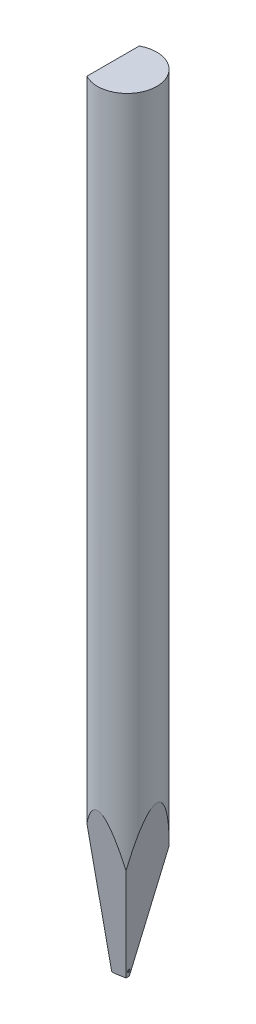
ISO-10303-21;
HEADER;
FILE_DESCRIPTION(('STEP AP214'),'2;1');
FILE_NAME('part.step','',(''),(''),'','','');
FILE_SCHEMA(('AUTOMOTIVE_DESIGN { 1 0 10303 214 1 1 1 1 }'));
ENDSEC;
DATA;
#1=APPLICATION_CONTEXT('core data for automotive mechanical design processes');
#2=APPLICATION_PROTOCOL_DEFINITION('international standard','automotive_design',2000,#1);
#3=PRODUCT_CONTEXT('',#1,'mechanical');
#4=PRODUCT('Part','Part','',(#3));
#5=PRODUCT_RELATED_PRODUCT_CATEGORY('part','',(#4));
#6=PRODUCT_DEFINITION_FORMATION('','',#4);
#7=PRODUCT_DEFINITION_CONTEXT('part definition',#1,'design');
#8=PRODUCT_DEFINITION('design','',#6,#7);
#9=PRODUCT_DEFINITION_SHAPE('','',#8);
#10=(LENGTH_UNIT() NAMED_UNIT(*) SI_UNIT(.MILLI.,.METRE.));
#11=(NAMED_UNIT(*) PLANE_ANGLE_UNIT() SI_UNIT($,.RADIAN.));
#12=(NAMED_UNIT(*) SI_UNIT($,.STERADIAN.) SOLID_ANGLE_UNIT());
#13=UNCERTAINTY_MEASURE_WITH_UNIT(LENGTH_MEASURE(1.E-05),#10,'distance_accuracy_value','');
#14=(GEOMETRIC_REPRESENTATION_CONTEXT(3) GLOBAL_UNCERTAINTY_ASSIGNED_CONTEXT((#13)) GLOBAL_UNIT_ASSIGNED_CONTEXT((#10,
#11,#12)) REPRESENTATION_CONTEXT('',''));
#15=CARTESIAN_POINT('',(0.,0.,0.));
#16=DIRECTION('',(0.,0.,1.));
#17=DIRECTION('',(1.,0.,0.));
#18=AXIS2_PLACEMENT_3D('',#15,#16,#17);
#19=CARTESIAN_POINT('',(-0.28702,0.,27.2760283406468));
#20=DIRECTION('',(-0.173648177666931,0.984807753012208,0.));
#21=DIRECTION('',(-0.984807753012208,-0.173648177666931,0.));
#22=AXIS2_PLACEMENT_3D('',#19,#20,#21);
#23=PLANE('',#22);
#24=DIRECTION('',(-0.984807753012208,-0.173648177666931,0.));
#25=VECTOR('',#24,1.);
#26=CARTESIAN_POINT('',(-0.28702,0.,0.0285749999999994));
#27=LINE('',#26,#25);
#28=CARTESIAN_POINT('',(-0.127,0.0282158434529687,0.0285749999999997));
#29=VERTEX_POINT('',#28);
#30=CARTESIAN_POINT('',(-0.279325890091772,0.00135667916935676,0.028575));
#31=VERTEX_POINT('',#30);
#32=EDGE_CURVE('E175',#29,#31,#27,.T.);
#33=ORIENTED_EDGE('',*,*,#32,.F.);
#34=DIRECTION('',(0.,0.,1.));
#35=VECTOR('',#34,1.);
#36=CARTESIAN_POINT('',(-0.127,0.0282158434529687,27.2760283406468));
#37=LINE('',#36,#35);
#38=CARTESIAN_POINT('',(-0.127,0.0282158434529687,-0.0285749999999997));
#39=VERTEX_POINT('',#38);
#40=EDGE_CURVE('E11',#39,#29,#37,.T.);
#41=ORIENTED_EDGE('',*,*,#40,.F.);
#42=DIRECTION('',(-0.984807753012208,-0.173648177666931,0.));
#43=VECTOR('',#42,1.);
#44=CARTESIAN_POINT('',(-0.28702,0.,-0.0285749999999994));
#45=LINE('',#44,#43);
#46=CARTESIAN_POINT('',(-0.279325890091772,0.00135667916935676,-0.028575));
#47=VERTEX_POINT('',#46);
#48=EDGE_CURVE('E172',#39,#47,#45,.T.);
#49=ORIENTED_EDGE('',*,*,#48,.T.);
#50=CARTESIAN_POINT('',(-1.21614610050796,-0.16383,0.));
#51=DIRECTION('',(-0.173648177666931,0.984807753012208,0.));
#52=DIRECTION('',(-0.984807753012208,-0.173648177666931,0.));
#53=AXIS2_PLACEMENT_3D('',#50,#51,#52);
#54=ELLIPSE('',#53,0.965400283794194,0.16764);
#55=CARTESIAN_POINT('',(-0.287019999999996,0.,-0.0355486570961342));
#56=VERTEX_POINT('',#55);
#57=EDGE_CURVE('E217',#47,#56,#54,.T.);
#58=ORIENTED_EDGE('',*,*,#57,.T.);
#59=DIRECTION('',(0.984346441568213,0.173566836012845,-0.0306045161452665));
#60=VECTOR('',#59,1.);
#61=CARTESIAN_POINT('',(26.0301980698046,4.64043560289492,-0.853793999030531));
#62=LINE('',#61,#60);
#63=CARTESIAN_POINT('',(0.0144531636701099,0.0531578527145794,-0.044933163670107));
#64=VERTEX_POINT('',#63);
#65=EDGE_CURVE('E264',#56,#64,#62,.T.);
#66=ORIENTED_EDGE('',*,*,#65,.T.);
#67=DIRECTION('',(0.,0.,-1.));
#68=VECTOR('',#67,1.);
#69=CARTESIAN_POINT('',(0.014453163670107,0.0531578527145792,27.2760283406468));
#70=LINE('',#69,#68);
#71=CARTESIAN_POINT('',(0.0144531636701099,0.0531578527145794,0.044933163670107));
#72=VERTEX_POINT('',#71);
#73=EDGE_CURVE('E230',#72,#64,#70,.T.);
#74=ORIENTED_EDGE('',*,*,#73,.F.);
#75=DIRECTION('',(-0.984346441568213,-0.173566836012845,-0.0306045161452665));
#76=VECTOR('',#75,1.);
#77=CARTESIAN_POINT('',(26.0301980698046,4.64043560289492,0.853793999030531));
#78=LINE('',#77,#76);
#79=CARTESIAN_POINT('',(-0.287019999999999,0.,0.0355486570961342));
#80=VERTEX_POINT('',#79);
#81=EDGE_CURVE('E239',#72,#80,#78,.T.);
#82=ORIENTED_EDGE('',*,*,#81,.T.);
#83=EDGE_CURVE('E220',#80,#31,#54,.T.);
#84=ORIENTED_EDGE('',*,*,#83,.T.);
#85=EDGE_LOOP('',(#33,#41,#49,#58,#66,#74,#82,#84));
#86=FACE_BOUND('',#85,.T.);
#87=ADVANCED_FACE('F43',(#86),#23,.F.);
#88=CARTESIAN_POINT('',(26.8452969491216,-0.16383,0.));
#89=DIRECTION('',(-1.,0.,0.));
#90=DIRECTION('',(0.,0.,1.));
#91=AXIS2_PLACEMENT_3D('',#88,#89,#90);
#92=CYLINDRICAL_SURFACE('',#91,0.16764);
#93=DIRECTION('',(-1.,0.,0.));
#94=VECTOR('',#93,1.);
#95=CARTESIAN_POINT('',(26.8452969491216,0.00135667916935676,0.028575));
#96=LINE('',#95,#94);
#97=CARTESIAN_POINT('',(-0.283721153032181,0.00135667916935721,0.028575));
#98=VERTEX_POINT('',#97);
#99=EDGE_CURVE('E51',#31,#98,#96,.T.);
#100=ORIENTED_EDGE('',*,*,#99,.F.);
#101=ORIENTED_EDGE('',*,*,#83,.F.);
#102=CARTESIAN_POINT('',(-0.287020000000002,0.,0.0355373141922684));
#103=DIRECTION('',(-1.,0.,0.));
#104=VECTOR('',#103,1.);
#105=LINE('',#102,#104);
#106=CARTESIAN_POINT('',(-0.353059999999998,0.,0.0355486570961357));
#107=VERTEX_POINT('',#106);
#108=EDGE_CURVE('E66',#80,#107,#105,.T.);
#109=ORIENTED_EDGE('',*,*,#108,.T.);
#110=CARTESIAN_POINT('',(-0.35306,0.,-0.0355373141922684));
#111=CARTESIAN_POINT('',(-0.353401676228332,-3.01305826774687E-07,-0.0355385465461654));
#112=CARTESIAN_POINT('',(-0.353741521198251,7.6475190170293E-06,-0.0355020719925349));
#113=CARTESIAN_POINT('',(-0.354402752593582,3.71858382742246E-05,-0.0353655548530326));
#114=CARTESIAN_POINT('',(-0.354724334412273,5.85771619935954E-05,-0.035266435661105));
#115=CARTESIAN_POINT('',(-0.35534274025854,0.000112120042814816,-0.0350166519633109));
#116=CARTESIAN_POINT('',(-0.355639704914783,0.00014420433375368,-0.0348663095582286));
#117=CARTESIAN_POINT('',(-0.356209878192902,0.000216229119612345,-0.034525863249799));
#118=CARTESIAN_POINT('',(-0.356482988603544,0.000256200070640058,-0.0343356050163106));
#119=CARTESIAN_POINT('',(-0.357221371780871,0.000376712399003243,-0.033756022577243));
#120=CARTESIAN_POINT('',(-0.357658454472984,0.000463436696752544,-0.0333323366780588));
#121=CARTESIAN_POINT('',(-0.358465611657672,0.000644490214620776,-0.0324272912999251));
#122=CARTESIAN_POINT('',(-0.358835478461097,0.000738841746632345,-0.0319457604524238));
#123=CARTESIAN_POINT('',(-0.359892874026866,0.00103225457364212,-0.0304089957666278));
#124=CARTESIAN_POINT('',(-0.360492948042148,0.00123453252941566,-0.029294964957523));
#125=CARTESIAN_POINT('',(-0.361544390719987,0.00162573316601484,-0.0269991959352651));
#126=CARTESIAN_POINT('',(-0.361995398664333,0.00181462259419065,-0.0258173014893918));
#127=CARTESIAN_POINT('',(-0.363349261088288,0.00241850828410463,-0.0217472593437435));
#128=CARTESIAN_POINT('',(-0.364008496288007,0.00278273034183303,-0.0187715359823547));
#129=CARTESIAN_POINT('',(-0.364988963516242,0.00335268272822711,-0.0127451587181595));
#130=CARTESIAN_POINT('',(-0.365308358541878,0.00355755008114865,-0.00969418788614373));
#131=CARTESIAN_POINT('',(-0.365797125690803,0.00387290273201646,-0.00172756749700898));
#132=CARTESIAN_POINT('',(-0.365760642856707,0.003852458533882,0.00320564099531285));
#133=CARTESIAN_POINT('',(-0.365032088984637,0.00337635229146227,0.0129860350392633));
#134=CARTESIAN_POINT('',(-0.364345692292675,0.00292445692784334,0.0178335955751342));
#135=CARTESIAN_POINT('',(-0.362806449851868,0.00218069612958676,0.0233317222476878));
#136=CARTESIAN_POINT('',(-0.362550064559817,0.00206075886177722,0.0241688535497544));
#137=CARTESIAN_POINT('',(-0.361982790070162,0.00181088081374169,0.0258256488322299));
#138=CARTESIAN_POINT('',(-0.361671767407261,0.00168091598500554,0.026645264396772));
#139=CARTESIAN_POINT('',(-0.360930640025496,0.00139343040991953,0.0283773350505101));
#140=CARTESIAN_POINT('',(-0.360489623011348,0.00123472274856926,0.029284980042596));
#141=CARTESIAN_POINT('',(-0.359486489731212,0.000915486821277803,0.0310300617377568));
#142=CARTESIAN_POINT('',(-0.358924973384943,0.000754971177864263,0.0318678186851792));
#143=CARTESIAN_POINT('',(-0.358016676225738,0.000542308429638207,0.0329395585039748));
#144=CARTESIAN_POINT('',(-0.357743496426062,0.000482980260899929,0.03323395388917));
#145=CARTESIAN_POINT('',(-0.357163755041537,0.00036940764134441,0.0337905893327732));
#146=CARTESIAN_POINT('',(-0.356857144798222,0.000315170820454957,0.0340527813067097));
#147=CARTESIAN_POINT('',(-0.356202462947117,0.000214561448598,0.0345342296531146));
#148=CARTESIAN_POINT('',(-0.355853824879065,0.000168323070057451,0.0347527615665999));
#149=CARTESIAN_POINT('',(-0.355120795964638,9.01428241635814E-05,0.0351196803756277));
#150=CARTESIAN_POINT('',(-0.354736629765114,5.8117675901153E-05,0.0352684761781993));
#151=CARTESIAN_POINT('',(-0.354132260351118,2.42078295944559E-05,0.0354255745457262));
#152=CARTESIAN_POINT('',(-0.353920891863477,1.52321489055404E-05,0.0354670391696922));
#153=CARTESIAN_POINT('',(-0.353493136186243,3.0840722896095E-06,0.0355230973614157));
#154=CARTESIAN_POINT('',(-0.35327672580883,-5.15089819667306E-08,0.0355375204693716));
#155=CARTESIAN_POINT('',(-0.353060000001577,-4.35655845896485E-13,0.035537314198241));
#156=B_SPLINE_CURVE_WITH_KNOTS('',3,(#110,#111,#112,#113,#114,#115,#116,#117,#118,#119,#120,
#121,#122,#123,#124,#125,#126,#127,#128,#129,#130,#131,#132,#133,#134,#135,#136,#137,#138,#139,
#140,#141,#142,#143,#144,#145,#146,#147,#148,#149,#150,#151,#152,#153,#154,#155),.UNSPECIFIED.,
.F.,.F.,(4,2,2,2,2,2,2,2,2,2,2,2,2,2,2,2,2,2,2,2,2,2,4),(0.,0.00102010063858993,
0.0020255047096136,0.00302469985808539,0.00402783193110229,0.00586179015558676,
0.00770132216199091,0.0115241688706669,0.0153561997156498,0.0245161556646618,0.0337253779668283,
0.0484749531005306,0.0630969269155427,0.0657465569053988,0.0684027516306054,0.0714624381702181,
0.0745072311905055,0.0757231838067599,0.0769409305006636,0.0781774560167603,0.0794066373728015,
0.0800517152217647,0.0807008459086714),.UNSPECIFIED.);
#157=CARTESIAN_POINT('',(-0.353060000000001,0.,-0.0355486570961344));
#158=VERTEX_POINT('',#157);
#159=EDGE_CURVE('E215',#158,#107,#156,.T.);
#160=ORIENTED_EDGE('',*,*,#159,.F.);
#161=CARTESIAN_POINT('',(-0.287019999999996,0.,-0.0355600000000001));
#162=DIRECTION('',(-1.,0.,0.));
#163=VECTOR('',#162,1.);
#164=LINE('',#161,#163);
#165=EDGE_CURVE('E244',#56,#158,#164,.T.);
#166=ORIENTED_EDGE('',*,*,#165,.F.);
#167=ORIENTED_EDGE('',*,*,#57,.F.);
#168=DIRECTION('',(-1.,0.,0.));
#169=VECTOR('',#168,1.);
#170=CARTESIAN_POINT('',(26.8452969491216,0.00135667916935676,-0.028575));
#171=LINE('',#170,#169);
#172=CARTESIAN_POINT('',(-0.283721153032181,0.00135667916935641,-0.028575));
#173=VERTEX_POINT('',#172);
#174=EDGE_CURVE('E221',#47,#173,#171,.T.);
#175=ORIENTED_EDGE('',*,*,#174,.T.);
#176=CARTESIAN_POINT('',(-0.28372115303218,0.0013566791693576,-0.028575));
#177=CARTESIAN_POINT('',(-0.285676016032885,0.00135549010679234,-0.0285758852426814));
#178=CARTESIAN_POINT('',(-0.287634112851868,0.0013826536146596,-0.0284245171298138));
#179=CARTESIAN_POINT('',(-0.291508420273466,0.00148848628630167,-0.027805778295134));
#180=CARTESIAN_POINT('',(-0.293424355171941,0.00156742660689815,-0.0273367435189977));
#181=CARTESIAN_POINT('',(-0.297151015657957,0.00177189061101251,-0.0260685953138943));
#182=CARTESIAN_POINT('',(-0.298961323642345,0.00189758638097331,-0.0252682612730122));
#183=CARTESIAN_POINT('',(-0.302393627827202,0.00217970311372509,-0.0233429438240899));
#184=CARTESIAN_POINT('',(-0.30401608085213,0.00233604693969155,-0.0222187722012883));
#185=CARTESIAN_POINT('',(-0.306846980118634,0.00264029455893621,-0.0198022043642477));
#186=CARTESIAN_POINT('',(-0.308080966193792,0.00278737504971632,-0.0185396301118555));
#187=CARTESIAN_POINT('',(-0.310292603054166,0.00306896740801358,-0.0158046230162942));
#188=CARTESIAN_POINT('',(-0.311270280449885,0.00320348057936207,-0.0143322119833393));
#189=CARTESIAN_POINT('',(-0.31284842183451,0.00342973214679568,-0.0113728074118362));
#190=CARTESIAN_POINT('',(-0.313475794624674,0.00352431089505386,-0.00990033032672064));
#191=CARTESIAN_POINT('',(-0.314462998769044,0.00367617584883751,-0.0068666855962327));
#192=CARTESIAN_POINT('',(-0.314822949909698,0.00373347874993791,-0.00530555799790223));
#193=CARTESIAN_POINT('',(-0.315252130828568,0.00380211043218951,-0.0022177866160163));
#194=CARTESIAN_POINT('',(-0.315334201796683,0.00381546905693404,-0.000692958590148848));
#195=CARTESIAN_POINT('',(-0.315241052870919,0.00380044330784581,0.00234855158658429));
#196=CARTESIAN_POINT('',(-0.315065858252187,0.00377206303466516,0.00386523452297485));
#197=CARTESIAN_POINT('',(-0.314467735929389,0.00367736769845003,0.00682813336831018));
#198=CARTESIAN_POINT('',(-0.314047871660997,0.00361152196561021,0.00827498522017013));
#199=CARTESIAN_POINT('',(-0.312976494113354,0.00344945595776706,0.0110781886439276));
#200=CARTESIAN_POINT('',(-0.312324980343118,0.00335323561838434,0.0124345400240007));
#201=CARTESIAN_POINT('',(-0.310800257950124,0.00313912804717928,0.0150404790921172));
#202=CARTESIAN_POINT('',(-0.309924010625799,0.00302095049717235,0.0162882614852328));
#203=CARTESIAN_POINT('',(-0.30798266095967,0.00277623786791639,0.0186256602535487));
#204=CARTESIAN_POINT('',(-0.306917538757082,0.00264970191063366,0.0197152599734124));
#205=CARTESIAN_POINT('',(-0.304579864463866,0.00239512804285118,0.0217597536721244));
#206=CARTESIAN_POINT('',(-0.303300207238726,0.00226727246153313,0.0227065289989814));
#207=CARTESIAN_POINT('',(-0.300608604421467,0.00202830311072972,0.0243909682856379));
#208=CARTESIAN_POINT('',(-0.299196596970595,0.00191719723375254,0.0251285338085844));
#209=CARTESIAN_POINT('',(-0.296159060507802,0.00171314034448675,0.026440772366303));
#210=CARTESIAN_POINT('',(-0.294525513852902,0.00162241854167634,0.0269971800617798));
#211=CARTESIAN_POINT('',(-0.291193765494126,0.00147924121888196,0.0278608442521309));
#212=CARTESIAN_POINT('',(-0.289495586514162,0.00142677237804829,0.0281681874830212));
#213=CARTESIAN_POINT('',(-0.286434898327653,0.00136915560301109,0.0285025937934751));
#214=CARTESIAN_POINT('',(-0.285077403407161,0.00135634338877994,0.0285752056592244));
#215=CARTESIAN_POINT('',(-0.283721153032191,0.00135667916934233,0.0285750000000952));
#216=B_SPLINE_CURVE_WITH_KNOTS('',3,(#176,#177,#178,#179,#180,#181,#182,#183,#184,#185,#186,
#187,#188,#189,#190,#191,#192,#193,#194,#195,#196,#197,#198,#199,#200,#201,#202,#203,#204,#205,
#206,#207,#208,#209,#210,#211,#212,#213,#214,#215),.UNSPECIFIED.,.F.,.F.,(4,2,2,2,2,2,2,2,2,2,2,
2,2,2,2,2,2,2,2,4),(0.,0.00586353999662044,0.0117580353898802,0.0176744440479217,
0.0235761488224113,0.028861619495758,0.0341465412029705,0.0389322289799366,0.0437157718043655,
0.0482750016519252,0.0528337836063307,0.0573366767938895,0.0618395795254554,0.0664069113144782,
0.0709747236577892,0.0757451440298452,0.0805178052584411,0.0856809628413382,0.0908423215951627,
0.0949114452939587),.UNSPECIFIED.);
#217=EDGE_CURVE('E311',#173,#98,#216,.T.);
#218=ORIENTED_EDGE('',*,*,#217,.T.);
#219=EDGE_LOOP('',(#100,#101,#109,#160,#166,#167,#175,#218));
#220=FACE_BOUND('',#219,.T.);
#221=ADVANCED_FACE('F185',(#220),#92,.F.);
#222=CARTESIAN_POINT('',(26.8738719491216,0.,0.03556));
#223=DIRECTION('',(0.,-0.173648177666931,0.984807753012208));
#224=DIRECTION('',(0.,-0.984807753012208,-0.173648177666931));
#225=AXIS2_PLACEMENT_3D('',#222,#223,#224);
#226=PLANE('',#225);
#227=CARTESIAN_POINT('',(-0.35306,0.02286,0.0395908347789985));
#228=DIRECTION('',(0.,-0.173648177666931,0.984807753012208));
#229=DIRECTION('',(0.,-0.984807753012208,-0.173648177666931));
#230=AXIS2_PLACEMENT_3D('',#227,#228,#229);
#231=ELLIPSE('',#230,0.0232126523477081,0.02286);
#232=CARTESIAN_POINT('',(-0.37592,0.02286,0.0395908347789985));
#233=VERTEX_POINT('',#232);
#234=EDGE_CURVE('E229',#107,#233,#231,.F.);
#235=ORIENTED_EDGE('',*,*,#234,.F.);
#236=ORIENTED_EDGE('',*,*,#108,.F.);
#237=ORIENTED_EDGE('',*,*,#81,.F.);
#238=DIRECTION('',(-0.171087869746036,-0.970287525247814,-0.171087869746036));
#239=VECTOR('',#238,1.);
#240=CARTESIAN_POINT('',(0.791557999082992,4.46033837772866,0.822037999082991));
#241=LINE('',#240,#239);
#242=CARTESIAN_POINT('',(0.544920706940428,3.06158878676079,0.575400706940426));
#243=VERTEX_POINT('',#242);
#244=EDGE_CURVE('E236',#243,#72,#241,.T.);
#245=ORIENTED_EDGE('',*,*,#244,.F.);
#246=CARTESIAN_POINT('',(0.,-0.201670781505604,0.));
#247=DIRECTION('',(0.,-0.173648177666931,0.984807753012208));
#248=DIRECTION('',(0.,-0.984807753012208,-0.173648177666931));
#249=AXIS2_PLACEMENT_3D('',#246,#247,#248);
#250=ELLIPSE('',#249,4.56371043248163,0.792479999999998);
#251=CARTESIAN_POINT('',(-0.37592,3.75487126564512,0.69764511322018));
#252=VERTEX_POINT('',#251);
#253=EDGE_CURVE('E240',#243,#252,#250,.T.);
#254=ORIENTED_EDGE('',*,*,#253,.T.);
#255=DIRECTION('',(0.,0.984807753012208,0.173648177666931));
#256=VECTOR('',#255,1.);
#257=CARTESIAN_POINT('',(-0.37592,20.2119919851942,3.59947952085301));
#258=LINE('',#257,#256);
#259=EDGE_CURVE('E256',#233,#252,#258,.T.);
#260=ORIENTED_EDGE('',*,*,#259,.F.);
#261=EDGE_LOOP('',(#235,#236,#237,#245,#254,#260));
#262=FACE_BOUND('',#261,.T.);
#263=ADVANCED_FACE('F195',(#262),#226,.T.);
#264=CARTESIAN_POINT('',(26.8738719491216,0.,-0.03556));
#265=DIRECTION('',(0.,-0.173648177666931,-0.984807753012208));
#266=DIRECTION('',(0.,0.984807753012208,-0.173648177666931));
#267=AXIS2_PLACEMENT_3D('',#264,#265,#266);
#268=PLANE('',#267);
#269=CARTESIAN_POINT('',(-0.35306,0.02286,-0.0395908347789985));
#270=DIRECTION('',(0.,-0.173648177666931,-0.984807753012208));
#271=DIRECTION('',(0.,0.984807753012208,-0.173648177666931));
#272=AXIS2_PLACEMENT_3D('',#269,#270,#271);
#273=ELLIPSE('',#272,0.0232126523477081,0.02286);
#274=CARTESIAN_POINT('',(-0.37592,0.02286,-0.0395908347789985));
#275=VERTEX_POINT('',#274);
#276=EDGE_CURVE('E303',#275,#158,#273,.F.);
#277=ORIENTED_EDGE('',*,*,#276,.F.);
#278=DIRECTION('',(0.,-0.984807753012208,0.173648177666931));
#279=VECTOR('',#278,1.);
#280=CARTESIAN_POINT('',(-0.37592,20.5699092247817,-3.66258998705298));
#281=LINE('',#280,#279);
#282=CARTESIAN_POINT('',(-0.37592,3.75487126564512,-0.69764511322018));
#283=VERTEX_POINT('',#282);
#284=EDGE_CURVE('E258',#283,#275,#281,.T.);
#285=ORIENTED_EDGE('',*,*,#284,.F.);
#286=CARTESIAN_POINT('',(0.,-0.201670781505604,0.));
#287=DIRECTION('',(0.,-0.173648177666931,-0.984807753012208));
#288=DIRECTION('',(0.,-0.984807753012208,0.173648177666931));
#289=AXIS2_PLACEMENT_3D('',#286,#287,#288);
#290=ELLIPSE('',#289,4.56371043248163,0.792479999999998);
#291=CARTESIAN_POINT('',(0.544920706940428,3.06158878676079,-0.575400706940426));
#292=VERTEX_POINT('',#291);
#293=EDGE_CURVE('E243',#283,#292,#290,.T.);
#294=ORIENTED_EDGE('',*,*,#293,.T.);
#295=DIRECTION('',(0.171087869746036,0.970287525247814,-0.171087869746036));
#296=VECTOR('',#295,1.);
#297=CARTESIAN_POINT('',(0.791557999082992,4.46033837772866,-0.822037999082991));
#298=LINE('',#297,#296);
#299=EDGE_CURVE('E261',#64,#292,#298,.T.);
#300=ORIENTED_EDGE('',*,*,#299,.F.);
#301=ORIENTED_EDGE('',*,*,#65,.F.);
#302=ORIENTED_EDGE('',*,*,#165,.T.);
#303=EDGE_LOOP('',(#277,#285,#294,#300,#301,#302));
#304=FACE_BOUND('',#303,.T.);
#305=ADVANCED_FACE('F283',(#304),#268,.T.);
#306=CARTESIAN_POINT('',(0.,21.0312,0.));
#307=DIRECTION('',(0.,-1.,0.));
#308=DIRECTION('',(0.,0.,-1.));
#309=AXIS2_PLACEMENT_3D('',#306,#307,#308);
#310=CYLINDRICAL_SURFACE('',#309,0.792479999999998);
#311=ORIENTED_EDGE('',*,*,#253,.F.);
#312=CARTESIAN_POINT('',(0.,-0.0288101116436568,0.));
#313=DIRECTION('',(-0.984807753012208,0.173648177666931,0.));
#314=DIRECTION('',(-0.173648177666931,-0.984807753012208,0.));
#315=AXIS2_PLACEMENT_3D('',#312,#313,#314);
#316=ELLIPSE('',#315,4.56371043248164,0.792479999999998);
#317=EDGE_CURVE('E233',#243,#292,#316,.T.);
#318=ORIENTED_EDGE('',*,*,#317,.T.);
#319=ORIENTED_EDGE('',*,*,#293,.F.);
#320=DIRECTION('',(0.,-1.,0.));
#321=VECTOR('',#320,1.);
#322=CARTESIAN_POINT('',(-0.37592,21.0312,-0.69764511322018));
#323=LINE('',#322,#321);
#324=CARTESIAN_POINT('',(-0.37592,21.0312,-0.69764511322018));
#325=VERTEX_POINT('',#324);
#326=EDGE_CURVE('E250',#325,#283,#323,.T.);
#327=ORIENTED_EDGE('',*,*,#326,.F.);
#328=CARTESIAN_POINT('',(0.,21.0312,0.));
#329=DIRECTION('',(0.,1.,0.));
#330=DIRECTION('',(0.,0.,1.));
#331=AXIS2_PLACEMENT_3D('',#328,#329,#330);
#332=CIRCLE('',#331,0.792479999999998);
#333=CARTESIAN_POINT('',(-0.37592,21.0312,0.69764511322018));
#334=VERTEX_POINT('',#333);
#335=EDGE_CURVE('E253',#334,#325,#332,.T.);
#336=ORIENTED_EDGE('',*,*,#335,.F.);
#337=DIRECTION('',(0.,-1.,0.));
#338=VECTOR('',#337,1.);
#339=CARTESIAN_POINT('',(-0.37592,21.0312,0.69764511322018));
#340=LINE('',#339,#338);
#341=EDGE_CURVE('E248',#252,#334,#340,.F.);
#342=ORIENTED_EDGE('',*,*,#341,.F.);
#343=EDGE_LOOP('',(#311,#318,#319,#327,#336,#342));
#344=FACE_BOUND('',#343,.T.);
#345=ADVANCED_FACE('F45',(#344),#310,.T.);
#346=CARTESIAN_POINT('',(-0.37592,21.0312,-1.04648));
#347=DIRECTION('',(-1.,0.,0.));
#348=DIRECTION('',(0.,0.,1.));
#349=AXIS2_PLACEMENT_3D('',#346,#347,#348);
#350=PLANE('',#349);
#351=DIRECTION('',(0.,0.,-1.));
#352=VECTOR('',#351,1.);
#353=CARTESIAN_POINT('',(-0.37592,0.02286,26.4484219491216));
#354=LINE('',#353,#352);
#355=EDGE_CURVE('E225',#233,#275,#354,.T.);
#356=ORIENTED_EDGE('',*,*,#355,.F.);
#357=ORIENTED_EDGE('',*,*,#259,.T.);
#358=ORIENTED_EDGE('',*,*,#341,.T.);
#359=DIRECTION('',(0.,0.,-1.));
#360=VECTOR('',#359,1.);
#361=CARTESIAN_POINT('',(-0.37592,21.0312,-1.04648));
#362=LINE('',#361,#360);
#363=EDGE_CURVE('E246',#334,#325,#362,.T.);
#364=ORIENTED_EDGE('',*,*,#363,.T.);
#365=ORIENTED_EDGE('',*,*,#326,.T.);
#366=ORIENTED_EDGE('',*,*,#284,.T.);
#367=EDGE_LOOP('',(#356,#357,#358,#364,#365,#366));
#368=FACE_BOUND('',#367,.T.);
#369=ADVANCED_FACE('F288',(#368),#350,.T.);
#370=CARTESIAN_POINT('',(0.,21.0312,0.));
#371=DIRECTION('',(0.,1.,0.));
#372=DIRECTION('',(0.,0.,1.));
#373=AXIS2_PLACEMENT_3D('',#370,#371,#372);
#374=PLANE('',#373);
#375=ORIENTED_EDGE('',*,*,#335,.T.);
#376=ORIENTED_EDGE('',*,*,#363,.F.);
#377=EDGE_LOOP('',(#375,#376));
#378=FACE_BOUND('',#377,.T.);
#379=ADVANCED_FACE('F328',(#378),#374,.T.);
#380=CARTESIAN_POINT('',(0.014453163670107,0.0531578527145792,27.2760283406468));
#381=DIRECTION('',(-0.984807753012208,0.173648177666931,0.));
#382=DIRECTION('',(-0.173648177666931,-0.984807753012208,0.));
#383=AXIS2_PLACEMENT_3D('',#380,#381,#382);
#384=PLANE('',#383);
#385=CARTESIAN_POINT('',(0.0416506766308395,0.207402613507598,0.));
#386=DIRECTION('',(-0.984807753012208,0.173648177666931,0.));
#387=DIRECTION('',(0.173648177666931,0.984807753012208,0.));
#388=AXIS2_PLACEMENT_3D('',#385,#386,#387);
#389=ELLIPSE('',#388,0.0439502823592256,0.0315688581959235);
#390=CARTESIAN_POINT('',(0.0492825630704661,0.250685192322039,0.));
#391=VERTEX_POINT('',#390);
#392=EDGE_CURVE('E177',#391,#391,#389,.F.);
#393=ORIENTED_EDGE('',*,*,#392,.F.);
#394=EDGE_LOOP('',(#393));
#395=FACE_BOUND('',#394,.T.);
#396=ORIENTED_EDGE('',*,*,#317,.F.);
#397=ORIENTED_EDGE('',*,*,#244,.T.);
#398=ORIENTED_EDGE('',*,*,#73,.T.);
#399=ORIENTED_EDGE('',*,*,#299,.T.);
#400=EDGE_LOOP('',(#396,#397,#398,#399));
#401=FACE_BOUND('',#400,.T.);
#402=ADVANCED_FACE('F325',(#395,#401),#384,.F.);
#403=CARTESIAN_POINT('',(-0.35306,0.02286,26.4484219491216));
#404=DIRECTION('',(0.,0.,-1.));
#405=DIRECTION('',(-1.,0.,0.));
#406=AXIS2_PLACEMENT_3D('',#403,#404,#405);
#407=CYLINDRICAL_SURFACE('',#406,0.02286);
#408=ORIENTED_EDGE('',*,*,#276,.T.);
#409=ORIENTED_EDGE('',*,*,#159,.T.);
#410=ORIENTED_EDGE('',*,*,#234,.T.);
#411=ORIENTED_EDGE('',*,*,#355,.T.);
#412=EDGE_LOOP('',(#408,#409,#410,#411));
#413=FACE_BOUND('',#412,.T.);
#414=ADVANCED_FACE('F200',(#413),#407,.T.);
#415=CARTESIAN_POINT('',(-0.127,0.0965200000000001,0.028575));
#416=DIRECTION('',(-1.,0.,0.));
#417=DIRECTION('',(0.,0.,1.));
#418=AXIS2_PLACEMENT_3D('',#415,#416,#417);
#419=PLANE('',#418);
#420=ORIENTED_EDGE('',*,*,#40,.T.);
#421=DIRECTION('',(0.,1.,0.));
#422=VECTOR('',#421,1.);
#423=CARTESIAN_POINT('',(-0.127,0.0965200000000001,0.028575));
#424=LINE('',#423,#422);
#425=CARTESIAN_POINT('',(-0.127,0.0965200000000001,0.028575));
#426=VERTEX_POINT('',#425);
#427=EDGE_CURVE('E158',#29,#426,#424,.T.);
#428=ORIENTED_EDGE('',*,*,#427,.T.);
#429=DIRECTION('',(0.,0.,-1.));
#430=VECTOR('',#429,1.);
#431=CARTESIAN_POINT('',(-0.127,0.0965200000000001,0.028575));
#432=LINE('',#431,#430);
#433=CARTESIAN_POINT('',(-0.127,0.0965200000000001,0.01905));
#434=VERTEX_POINT('',#433);
#435=EDGE_CURVE('E147',#426,#434,#432,.T.);
#436=ORIENTED_EDGE('',*,*,#435,.T.);
#437=CARTESIAN_POINT('',(-0.127,0.09652,0.));
#438=DIRECTION('',(-1.,0.,0.));
#439=DIRECTION('',(0.,1.,0.));
#440=AXIS2_PLACEMENT_3D('',#437,#438,#439);
#441=ELLIPSE('',#440,0.0219970452561247,0.01905);
#442=CARTESIAN_POINT('',(-0.127,0.0965200000000001,-0.01905));
#443=VERTEX_POINT('',#442);
#444=EDGE_CURVE('E139',#434,#443,#441,.F.);
#445=ORIENTED_EDGE('',*,*,#444,.T.);
#446=CARTESIAN_POINT('',(-0.127,0.0965200000000001,-0.028575));
#447=VERTEX_POINT('',#446);
#448=EDGE_CURVE('E144',#443,#447,#432,.T.);
#449=ORIENTED_EDGE('',*,*,#448,.T.);
#450=DIRECTION('',(0.,1.,0.));
#451=VECTOR('',#450,1.);
#452=CARTESIAN_POINT('',(-0.127,0.0965200000000001,-0.028575));
#453=LINE('',#452,#451);
#454=EDGE_CURVE('E165',#39,#447,#453,.T.);
#455=ORIENTED_EDGE('',*,*,#454,.F.);
#456=EDGE_LOOP('',(#420,#428,#436,#445,#449,#455));
#457=FACE_BOUND('',#456,.T.);
#458=ADVANCED_FACE('F141',(#457),#419,.T.);
#459=CARTESIAN_POINT('',(0.0169389803475446,0.179623209050534,0.));
#460=DIRECTION('',(0.866025403784441,0.499999999999995,0.));
#461=DIRECTION('',(-0.499999999999995,0.866025403784441,0.));
#462=AXIS2_PLACEMENT_3D('',#459,#460,#461);
#463=CONICAL_SURFACE('',#462,0.01905,0.392699081698725);
#464=CARTESIAN_POINT('',(0.0169389803475446,0.179623209050534,0.));
#465=DIRECTION('',(0.866025403784441,0.499999999999995,0.));
#466=DIRECTION('',(-0.499999999999995,0.866025403784441,0.));
#467=AXIS2_PLACEMENT_3D('',#464,#465,#466);
#468=CIRCLE('',#467,0.01905);
#469=CARTESIAN_POINT('',(0.00741398034754469,0.196120992992628,0.));
#470=VERTEX_POINT('',#469);
#471=EDGE_CURVE('E154',#470,#470,#468,.T.);
#472=ORIENTED_EDGE('',*,*,#471,.F.);
#473=EDGE_LOOP('',(#472));
#474=FACE_BOUND('',#473,.T.);
#475=ORIENTED_EDGE('',*,*,#392,.T.);
#476=EDGE_LOOP('',(#475));
#477=FACE_BOUND('',#476,.T.);
#478=ADVANCED_FACE('F323',(#474,#477),#463,.F.);
#479=CARTESIAN_POINT('',(-0.22877858413363,0.0965200000000001,0.));
#480=DIRECTION('',(-0.500000000000004,-0.866025403784436,0.));
#481=DIRECTION('',(0.866025403784436,-0.500000000000004,0.));
#482=AXIS2_PLACEMENT_3D('',#479,#480,#481);
#483=CYLINDRICAL_SURFACE('',#482,0.028575);
#484=DIRECTION('',(0.500000000000004,0.866025403784436,0.));
#485=VECTOR('',#484,1.);
#486=CARTESIAN_POINT('',(-0.22877858413363,0.0965200000000001,-0.028575));
#487=LINE('',#486,#485);
#488=CARTESIAN_POINT('',(-0.22877858413363,0.0965200000000001,-0.028575));
#489=VERTEX_POINT('',#488);
#490=EDGE_CURVE('E58',#173,#489,#487,.T.);
#491=ORIENTED_EDGE('',*,*,#490,.T.);
#492=CARTESIAN_POINT('',(-0.22877858413363,0.0965200000000001,0.));
#493=DIRECTION('',(0.,-1.,0.));
#494=DIRECTION('',(-1.,0.,0.));
#495=AXIS2_PLACEMENT_3D('',#492,#493,#494);
#496=ELLIPSE('',#495,0.0329955678841872,0.028575);
#497=CARTESIAN_POINT('',(-0.22877858413363,0.0965200000000001,0.028575));
#498=VERTEX_POINT('',#497);
#499=EDGE_CURVE('E170',#489,#498,#496,.F.);
#500=ORIENTED_EDGE('',*,*,#499,.T.);
#501=DIRECTION('',(-0.500000000000004,-0.866025403784436,0.));
#502=VECTOR('',#501,1.);
#503=CARTESIAN_POINT('',(-0.213378324086859,0.12319403285078,0.028575));
#504=LINE('',#503,#502);
#505=EDGE_CURVE('E160',#498,#98,#504,.T.);
#506=ORIENTED_EDGE('',*,*,#505,.T.);
#507=ORIENTED_EDGE('',*,*,#217,.F.);
#508=EDGE_LOOP('',(#491,#500,#506,#507));
#509=FACE_BOUND('',#508,.T.);
#510=ADVANCED_FACE('F197',(#509),#483,.F.);
#511=CARTESIAN_POINT('',(0.,0.,0.028575));
#512=DIRECTION('',(0.,0.,-1.));
#513=DIRECTION('',(-1.,0.,0.));
#514=AXIS2_PLACEMENT_3D('',#511,#512,#513);
#515=PLANE('',#514);
#516=ORIENTED_EDGE('',*,*,#32,.T.);
#517=ORIENTED_EDGE('',*,*,#99,.T.);
#518=ORIENTED_EDGE('',*,*,#505,.F.);
#519=DIRECTION('',(-1.,0.,0.));
#520=VECTOR('',#519,1.);
#521=CARTESIAN_POINT('',(-0.261774152017817,0.0965200000000001,0.028575));
#522=LINE('',#521,#520);
#523=EDGE_CURVE('E161',#426,#498,#522,.T.);
#524=ORIENTED_EDGE('',*,*,#523,.F.);
#525=ORIENTED_EDGE('',*,*,#427,.F.);
#526=EDGE_LOOP('',(#516,#517,#518,#524,#525));
#527=FACE_BOUND('',#526,.T.);
#528=ADVANCED_FACE('F359',(#527),#515,.T.);
#529=CARTESIAN_POINT('',(0.,0.,-0.028575));
#530=DIRECTION('',(0.,0.,-1.));
#531=DIRECTION('',(-1.,0.,0.));
#532=AXIS2_PLACEMENT_3D('',#529,#530,#531);
#533=PLANE('',#532);
#534=ORIENTED_EDGE('',*,*,#454,.T.);
#535=DIRECTION('',(-1.,0.,0.));
#536=VECTOR('',#535,1.);
#537=CARTESIAN_POINT('',(-0.261774152017817,0.0965200000000001,-0.028575));
#538=LINE('',#537,#536);
#539=EDGE_CURVE('E149',#447,#489,#538,.T.);
#540=ORIENTED_EDGE('',*,*,#539,.T.);
#541=ORIENTED_EDGE('',*,*,#490,.F.);
#542=ORIENTED_EDGE('',*,*,#174,.F.);
#543=ORIENTED_EDGE('',*,*,#48,.F.);
#544=EDGE_LOOP('',(#534,#540,#541,#542,#543));
#545=FACE_BOUND('',#544,.T.);
#546=ADVANCED_FACE('F344',(#545),#533,.F.);
#547=CARTESIAN_POINT('',(-0.261774152017817,0.0965200000000001,0.028575));
#548=DIRECTION('',(0.,-1.,0.));
#549=DIRECTION('',(0.,0.,-1.));
#550=AXIS2_PLACEMENT_3D('',#547,#548,#549);
#551=PLANE('',#550);
#552=ORIENTED_EDGE('',*,*,#539,.F.);
#553=ORIENTED_EDGE('',*,*,#448,.F.);
#554=CARTESIAN_POINT('',(-0.127,0.0965200000000001,0.));
#555=DIRECTION('',(0.,-1.,0.));
#556=DIRECTION('',(1.,0.,0.));
#557=AXIS2_PLACEMENT_3D('',#554,#555,#556);
#558=ELLIPSE('',#557,0.0381000000000004,0.01905);
#559=EDGE_CURVE('E150',#443,#434,#558,.F.);
#560=ORIENTED_EDGE('',*,*,#559,.T.);
#561=ORIENTED_EDGE('',*,*,#435,.F.);
#562=ORIENTED_EDGE('',*,*,#523,.T.);
#563=ORIENTED_EDGE('',*,*,#499,.F.);
#564=EDGE_LOOP('',(#552,#553,#560,#561,#562,#563));
#565=FACE_BOUND('',#564,.T.);
#566=ADVANCED_FACE('F156',(#565),#551,.T.);
#567=CARTESIAN_POINT('',(-0.313401436794207,-0.0110989197104668,0.));
#568=DIRECTION('',(0.866025403784441,0.499999999999995,0.));
#569=DIRECTION('',(-0.499999999999995,0.866025403784441,0.));
#570=AXIS2_PLACEMENT_3D('',#567,#568,#569);
#571=CYLINDRICAL_SURFACE('',#570,0.01905);
#572=ORIENTED_EDGE('',*,*,#471,.T.);
#573=EDGE_LOOP('',(#572));
#574=FACE_BOUND('',#573,.T.);
#575=ORIENTED_EDGE('',*,*,#559,.F.);
#576=ORIENTED_EDGE('',*,*,#444,.F.);
#577=EDGE_LOOP('',(#575,#576));
#578=FACE_BOUND('',#577,.T.);
#579=ADVANCED_FACE('F152',(#574,#578),#571,.F.);
#580=CLOSED_SHELL('',(#87,#221,#263,#305,#345,#369,#379,#402,#414,#458,#478,#510,#528,#546,#566,#579));
#581=MANIFOLD_SOLID_BREP('B2',#580);
#582=ADVANCED_BREP_SHAPE_REPRESENTATION('',(#18,#581),#14);
#583=SHAPE_DEFINITION_REPRESENTATION(#9,#582);
ENDSEC;
END-ISO-10303-21;
